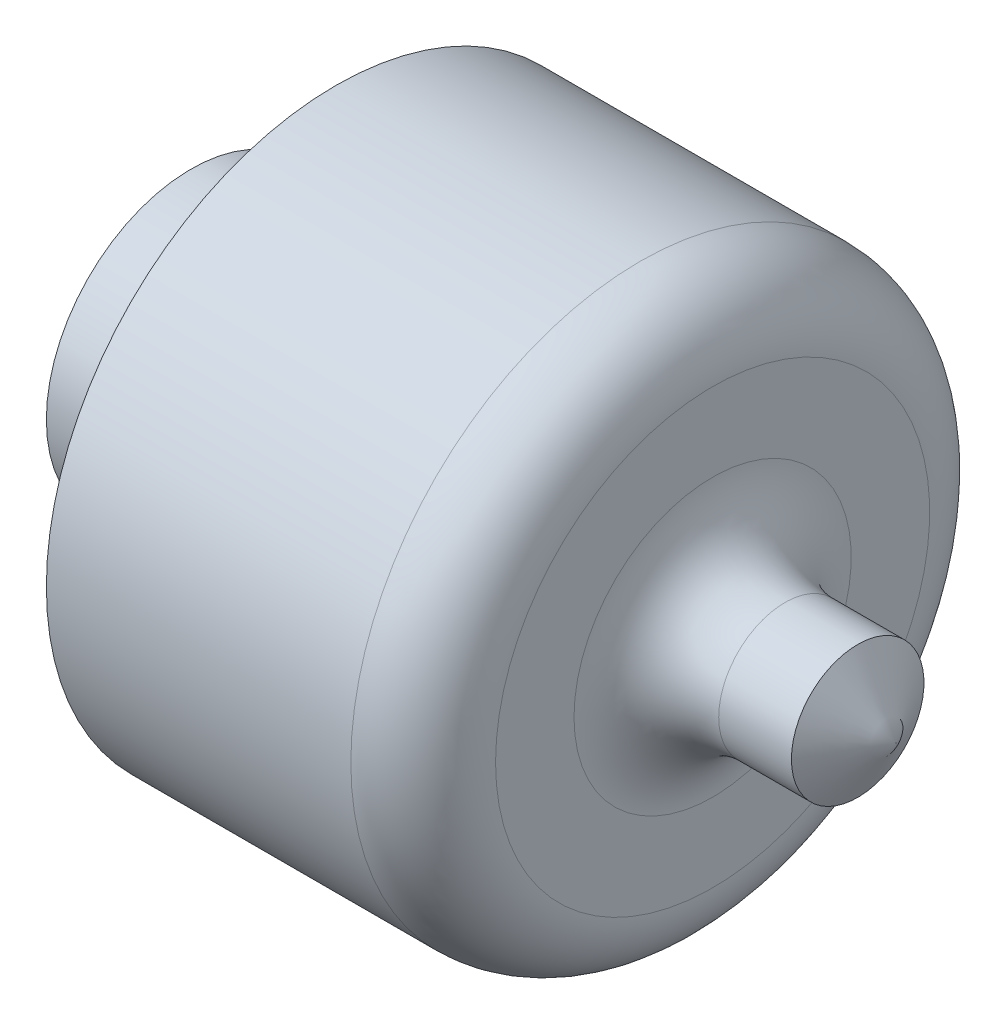
ISO-10303-21;
HEADER;
FILE_DESCRIPTION(('STEP AP214'),'2;1');
FILE_NAME('part.step','',(''),(''),'','','');
FILE_SCHEMA(('AUTOMOTIVE_DESIGN { 1 0 10303 214 1 1 1 1 }'));
ENDSEC;
DATA;
#1=APPLICATION_CONTEXT('core data for automotive mechanical design processes');
#2=APPLICATION_PROTOCOL_DEFINITION('international standard','automotive_design',2000,#1);
#3=PRODUCT_CONTEXT('',#1,'mechanical');
#4=PRODUCT('Part','Part','',(#3));
#5=PRODUCT_RELATED_PRODUCT_CATEGORY('part','',(#4));
#6=PRODUCT_DEFINITION_FORMATION('','',#4);
#7=PRODUCT_DEFINITION_CONTEXT('part definition',#1,'design');
#8=PRODUCT_DEFINITION('design','',#6,#7);
#9=PRODUCT_DEFINITION_SHAPE('','',#8);
#10=(LENGTH_UNIT() NAMED_UNIT(*) SI_UNIT(.MILLI.,.METRE.));
#11=(NAMED_UNIT(*) PLANE_ANGLE_UNIT() SI_UNIT($,.RADIAN.));
#12=(NAMED_UNIT(*) SI_UNIT($,.STERADIAN.) SOLID_ANGLE_UNIT());
#13=UNCERTAINTY_MEASURE_WITH_UNIT(LENGTH_MEASURE(1.E-05),#10,'distance_accuracy_value','');
#14=(GEOMETRIC_REPRESENTATION_CONTEXT(3) GLOBAL_UNCERTAINTY_ASSIGNED_CONTEXT((#13)) GLOBAL_UNIT_ASSIGNED_CONTEXT((#10,
#11,#12)) REPRESENTATION_CONTEXT('',''));
#15=CARTESIAN_POINT('',(0.,0.,0.));
#16=DIRECTION('',(0.,0.,1.));
#17=DIRECTION('',(1.,0.,0.));
#18=AXIS2_PLACEMENT_3D('',#15,#16,#17);
#19=CARTESIAN_POINT('',(0.,10.,0.));
#20=DIRECTION('',(1.,0.,0.));
#21=DIRECTION('',(0.,0.,-1.));
#22=AXIS2_PLACEMENT_3D('',#19,#20,#21);
#23=PLANE('',#22);
#24=CARTESIAN_POINT('',(0.,0.,0.));
#25=DIRECTION('',(-1.,0.,0.));
#26=DIRECTION('',(0.,0.,1.));
#27=AXIS2_PLACEMENT_3D('',#24,#25,#26);
#28=CIRCLE('',#27,10.);
#29=CARTESIAN_POINT('',(0.,0.,10.));
#30=VERTEX_POINT('',#29);
#31=EDGE_CURVE('E11',#30,#30,#28,.T.);
#32=ORIENTED_EDGE('',*,*,#31,.T.);
#33=EDGE_LOOP('',(#32));
#34=FACE_BOUND('',#33,.T.);
#35=ADVANCED_FACE('F33',(#34),#23,.F.);
#36=CARTESIAN_POINT('',(0.,0.,0.));
#37=DIRECTION('',(-1.,0.,0.));
#38=DIRECTION('',(0.,0.,1.));
#39=AXIS2_PLACEMENT_3D('',#36,#37,#38);
#40=CYLINDRICAL_SURFACE('',#39,10.);
#41=ORIENTED_EDGE('',*,*,#31,.F.);
#42=EDGE_LOOP('',(#41));
#43=FACE_BOUND('',#42,.T.);
#44=CARTESIAN_POINT('',(10.,0.,0.));
#45=DIRECTION('',(-1.,0.,0.));
#46=DIRECTION('',(0.,0.,1.));
#47=AXIS2_PLACEMENT_3D('',#44,#45,#46);
#48=CIRCLE('',#47,10.);
#49=CARTESIAN_POINT('',(10.,0.,10.));
#50=VERTEX_POINT('',#49);
#51=EDGE_CURVE('E39',#50,#50,#48,.T.);
#52=ORIENTED_EDGE('',*,*,#51,.T.);
#53=EDGE_LOOP('',(#52));
#54=FACE_BOUND('',#53,.T.);
#55=ADVANCED_FACE('F55',(#43,#54),#40,.T.);
#56=CARTESIAN_POINT('',(10.,20.,0.));
#57=DIRECTION('',(1.,0.,0.));
#58=DIRECTION('',(0.,0.,-1.));
#59=AXIS2_PLACEMENT_3D('',#56,#57,#58);
#60=PLANE('',#59);
#61=ORIENTED_EDGE('',*,*,#51,.F.);
#62=EDGE_LOOP('',(#61));
#63=FACE_BOUND('',#62,.T.);
#64=CARTESIAN_POINT('',(10.,0.,0.));
#65=DIRECTION('',(-1.,0.,0.));
#66=DIRECTION('',(0.,0.,1.));
#67=AXIS2_PLACEMENT_3D('',#64,#65,#66);
#68=CIRCLE('',#67,20.);
#69=CARTESIAN_POINT('',(10.,0.,20.));
#70=VERTEX_POINT('',#69);
#71=EDGE_CURVE('E67',#70,#70,#68,.T.);
#72=ORIENTED_EDGE('',*,*,#71,.T.);
#73=EDGE_LOOP('',(#72));
#74=FACE_BOUND('',#73,.T.);
#75=ADVANCED_FACE('F60',(#63,#74),#60,.F.);
#76=CARTESIAN_POINT('',(0.,0.,0.));
#77=DIRECTION('',(-1.,0.,0.));
#78=DIRECTION('',(0.,0.,1.));
#79=AXIS2_PLACEMENT_3D('',#76,#77,#78);
#80=CYLINDRICAL_SURFACE('',#79,20.);
#81=ORIENTED_EDGE('',*,*,#71,.F.);
#82=EDGE_LOOP('',(#81));
#83=FACE_BOUND('',#82,.T.);
#84=CARTESIAN_POINT('',(31.0390408738942,0.,0.));
#85=DIRECTION('',(-1.,0.,0.));
#86=DIRECTION('',(0.,0.,1.));
#87=AXIS2_PLACEMENT_3D('',#84,#85,#86);
#88=CIRCLE('',#87,20.);
#89=CARTESIAN_POINT('',(31.0390408738942,0.,20.));
#90=VERTEX_POINT('',#89);
#91=EDGE_CURVE('E69',#90,#90,#88,.T.);
#92=ORIENTED_EDGE('',*,*,#91,.T.);
#93=EDGE_LOOP('',(#92));
#94=FACE_BOUND('',#93,.T.);
#95=ADVANCED_FACE('F102',(#83,#94),#80,.T.);
#96=CARTESIAN_POINT('',(31.0390408738942,0.,0.));
#97=DIRECTION('',(-1.,0.,0.));
#98=DIRECTION('',(0.,0.,1.));
#99=AXIS2_PLACEMENT_3D('',#96,#97,#98);
#100=TOROIDAL_SURFACE('',#99,15.,5.);
#101=ORIENTED_EDGE('',*,*,#91,.F.);
#102=EDGE_LOOP('',(#101));
#103=FACE_BOUND('',#102,.T.);
#104=CARTESIAN_POINT('',(36.0390408738942,0.,0.));
#105=DIRECTION('',(-1.,0.,0.));
#106=DIRECTION('',(0.,0.,1.));
#107=AXIS2_PLACEMENT_3D('',#104,#105,#106);
#108=CIRCLE('',#107,15.);
#109=CARTESIAN_POINT('',(36.0390408738942,0.,15.));
#110=VERTEX_POINT('',#109);
#111=EDGE_CURVE('E74',#110,#110,#108,.T.);
#112=ORIENTED_EDGE('',*,*,#111,.T.);
#113=EDGE_LOOP('',(#112));
#114=FACE_BOUND('',#113,.T.);
#115=ADVANCED_FACE('F95',(#103,#114),#100,.T.);
#116=CARTESIAN_POINT('',(36.0390408738942,9.57934986640967,0.));
#117=DIRECTION('',(-1.,0.,0.));
#118=DIRECTION('',(0.,0.,1.));
#119=AXIS2_PLACEMENT_3D('',#116,#117,#118);
#120=PLANE('',#119);
#121=ORIENTED_EDGE('',*,*,#111,.F.);
#122=EDGE_LOOP('',(#121));
#123=FACE_BOUND('',#122,.T.);
#124=CARTESIAN_POINT('',(36.0390408738942,0.,0.));
#125=DIRECTION('',(-1.,0.,0.));
#126=DIRECTION('',(0.,0.,1.));
#127=AXIS2_PLACEMENT_3D('',#124,#125,#126);
#128=CIRCLE('',#127,9.57934986640967);
#129=CARTESIAN_POINT('',(36.0390408738942,0.,9.57934986640967));
#130=VERTEX_POINT('',#129);
#131=EDGE_CURVE('E77',#130,#130,#128,.T.);
#132=ORIENTED_EDGE('',*,*,#131,.T.);
#133=EDGE_LOOP('',(#132));
#134=FACE_BOUND('',#133,.T.);
#135=ADVANCED_FACE('F89',(#123,#134),#120,.F.);
#136=CARTESIAN_POINT('',(41.0390408738942,0.,0.));
#137=DIRECTION('',(-1.,0.,0.));
#138=DIRECTION('',(0.,0.,1.));
#139=AXIS2_PLACEMENT_3D('',#136,#137,#138);
#140=TOROIDAL_SURFACE('',#139,9.57934986640967,5.);
#141=ORIENTED_EDGE('',*,*,#131,.F.);
#142=EDGE_LOOP('',(#141));
#143=FACE_BOUND('',#142,.T.);
#144=CARTESIAN_POINT('',(41.0390408738942,0.,0.));
#145=DIRECTION('',(-1.,0.,0.));
#146=DIRECTION('',(0.,0.,1.));
#147=AXIS2_PLACEMENT_3D('',#144,#145,#146);
#148=CIRCLE('',#147,4.57934986640967);
#149=CARTESIAN_POINT('',(41.0390408738942,0.,4.57934986640967));
#150=VERTEX_POINT('',#149);
#151=EDGE_CURVE('E80',#150,#150,#148,.T.);
#152=ORIENTED_EDGE('',*,*,#151,.T.);
#153=EDGE_LOOP('',(#152));
#154=FACE_BOUND('',#153,.T.);
#155=ADVANCED_FACE('F50',(#143,#154),#140,.F.);
#156=CARTESIAN_POINT('',(0.,0.,0.));
#157=DIRECTION('',(-1.,0.,0.));
#158=DIRECTION('',(0.,0.,1.));
#159=AXIS2_PLACEMENT_3D('',#156,#157,#158);
#160=CYLINDRICAL_SURFACE('',#159,4.57934986640967);
#161=ORIENTED_EDGE('',*,*,#151,.F.);
#162=EDGE_LOOP('',(#161));
#163=FACE_BOUND('',#162,.T.);
#164=CARTESIAN_POINT('',(46.062888871111,0.,0.));
#165=DIRECTION('',(-1.,0.,0.));
#166=DIRECTION('',(0.,0.,1.));
#167=AXIS2_PLACEMENT_3D('',#164,#165,#166);
#168=CIRCLE('',#167,4.57934986640967);
#169=CARTESIAN_POINT('',(46.062888871111,0.,4.57934986640967));
#170=VERTEX_POINT('',#169);
#171=EDGE_CURVE('E83',#170,#170,#168,.T.);
#172=ORIENTED_EDGE('',*,*,#171,.T.);
#173=EDGE_LOOP('',(#172));
#174=FACE_BOUND('',#173,.T.);
#175=ADVANCED_FACE('F44',(#163,#174),#160,.T.);
#176=CARTESIAN_POINT('',(48.7067777491961,0.,0.));
#177=DIRECTION('',(-1.,0.,0.));
#178=DIRECTION('',(0.,0.,1.));
#179=AXIS2_PLACEMENT_3D('',#176,#177,#178);
#180=CONICAL_SURFACE('',#179,0.,1.04719755119659);
#181=ORIENTED_EDGE('',*,*,#171,.F.);
#182=EDGE_LOOP('',(#181));
#183=FACE_BOUND('',#182,.T.);
#184=CARTESIAN_POINT('',(48.7067777491961,0.,0.));
#185=VERTEX_POINT('',#184);
#186=VERTEX_LOOP('',#185);
#187=FACE_BOUND('',#186,.T.);
#188=ADVANCED_FACE('F42',(#183,#187),#180,.T.);
#189=CLOSED_SHELL('',(#35,#55,#75,#95,#115,#135,#155,#175,#188));
#190=MANIFOLD_SOLID_BREP('B2',#189);
#191=ADVANCED_BREP_SHAPE_REPRESENTATION('',(#18,#190),#14);
#192=SHAPE_DEFINITION_REPRESENTATION(#9,#191);
ENDSEC;
END-ISO-10303-21;
